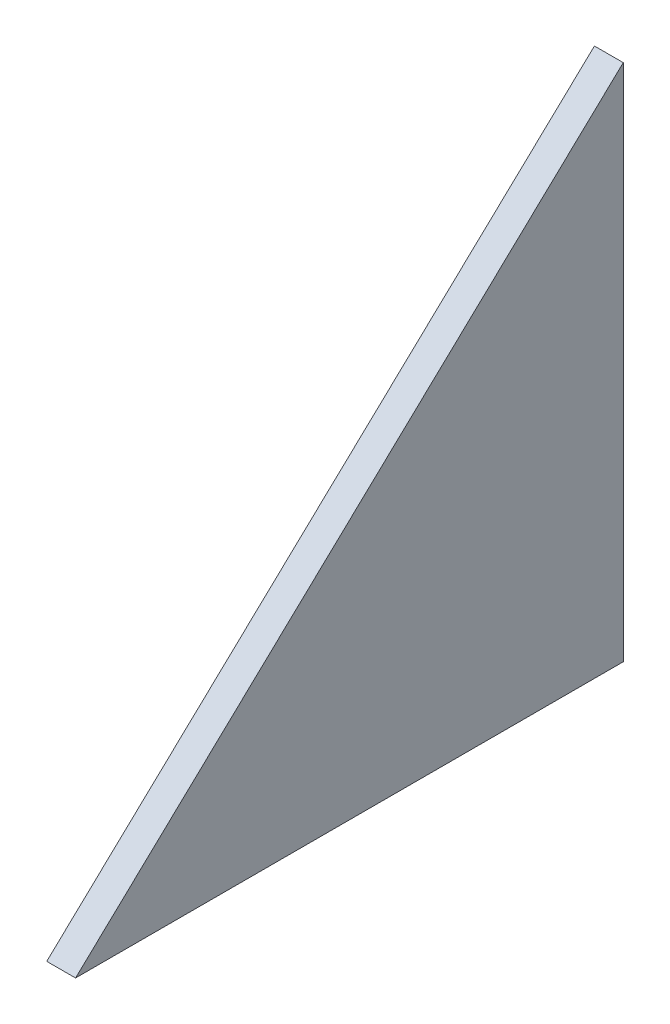
ISO-10303-21;
HEADER;
FILE_DESCRIPTION(('STEP AP214'),'2;1');
FILE_NAME('part.step','',(''),(''),'','','');
FILE_SCHEMA(('AUTOMOTIVE_DESIGN { 1 0 10303 214 1 1 1 1 }'));
ENDSEC;
DATA;
#1=APPLICATION_CONTEXT('core data for automotive mechanical design processes');
#2=APPLICATION_PROTOCOL_DEFINITION('international standard','automotive_design',2000,#1);
#3=PRODUCT_CONTEXT('',#1,'mechanical');
#4=PRODUCT('Part','Part','',(#3));
#5=PRODUCT_RELATED_PRODUCT_CATEGORY('part','',(#4));
#6=PRODUCT_DEFINITION_FORMATION('','',#4);
#7=PRODUCT_DEFINITION_CONTEXT('part definition',#1,'design');
#8=PRODUCT_DEFINITION('design','',#6,#7);
#9=PRODUCT_DEFINITION_SHAPE('','',#8);
#10=(LENGTH_UNIT() NAMED_UNIT(*) SI_UNIT(.MILLI.,.METRE.));
#11=(NAMED_UNIT(*) PLANE_ANGLE_UNIT() SI_UNIT($,.RADIAN.));
#12=(NAMED_UNIT(*) SI_UNIT($,.STERADIAN.) SOLID_ANGLE_UNIT());
#13=UNCERTAINTY_MEASURE_WITH_UNIT(LENGTH_MEASURE(1.E-05),#10,'distance_accuracy_value','');
#14=(GEOMETRIC_REPRESENTATION_CONTEXT(3) GLOBAL_UNCERTAINTY_ASSIGNED_CONTEXT((#13)) GLOBAL_UNIT_ASSIGNED_CONTEXT((#10,
#11,#12)) REPRESENTATION_CONTEXT('',''));
#15=CARTESIAN_POINT('',(0.,0.,0.));
#16=DIRECTION('',(0.,0.,1.));
#17=DIRECTION('',(1.,0.,0.));
#18=AXIS2_PLACEMENT_3D('',#15,#16,#17);
#19=CARTESIAN_POINT('',(5.,0.,0.));
#20=DIRECTION('',(0.,-0.725952683905827,-0.687744647910783));
#21=DIRECTION('',(0.,0.687744647910783,-0.725952683905827));
#22=AXIS2_PLACEMENT_3D('',#19,#20,#21);
#23=PLANE('',#22);
#24=DIRECTION('',(0.,-0.687744647910783,0.725952683905827));
#25=VECTOR('',#24,1.);
#26=CARTESIAN_POINT('',(0.,0.,0.));
#27=LINE('',#26,#25);
#28=CARTESIAN_POINT('',(0.,90.,-95.));
#29=VERTEX_POINT('',#28);
#30=CARTESIAN_POINT('',(0.,0.,0.));
#31=VERTEX_POINT('',#30);
#32=EDGE_CURVE('E86',#29,#31,#27,.T.);
#33=ORIENTED_EDGE('',*,*,#32,.T.);
#34=DIRECTION('',(-1.,0.,0.));
#35=VECTOR('',#34,1.);
#36=CARTESIAN_POINT('',(5.,0.,0.));
#37=LINE('',#36,#35);
#38=CARTESIAN_POINT('',(5.,0.,0.));
#39=VERTEX_POINT('',#38);
#40=EDGE_CURVE('E11',#39,#31,#37,.T.);
#41=ORIENTED_EDGE('',*,*,#40,.F.);
#42=DIRECTION('',(0.,-0.687744647910783,0.725952683905827));
#43=VECTOR('',#42,1.);
#44=CARTESIAN_POINT('',(5.,0.,0.));
#45=LINE('',#44,#43);
#46=CARTESIAN_POINT('',(5.,90.,-95.));
#47=VERTEX_POINT('',#46);
#48=EDGE_CURVE('E79',#47,#39,#45,.T.);
#49=ORIENTED_EDGE('',*,*,#48,.F.);
#50=DIRECTION('',(-1.,0.,0.));
#51=VECTOR('',#50,1.);
#52=CARTESIAN_POINT('',(5.,90.,-95.));
#53=LINE('',#52,#51);
#54=EDGE_CURVE('E87',#47,#29,#53,.T.);
#55=ORIENTED_EDGE('',*,*,#54,.T.);
#56=EDGE_LOOP('',(#33,#41,#49,#55));
#57=FACE_BOUND('',#56,.T.);
#58=ADVANCED_FACE('F39',(#57),#23,.F.);
#59=CARTESIAN_POINT('',(5.,0.,0.));
#60=DIRECTION('',(0.,1.,0.));
#61=DIRECTION('',(0.,0.,1.));
#62=AXIS2_PLACEMENT_3D('',#59,#60,#61);
#63=PLANE('',#62);
#64=DIRECTION('',(0.,0.,-1.));
#65=VECTOR('',#64,1.);
#66=CARTESIAN_POINT('',(0.,0.,0.));
#67=LINE('',#66,#65);
#68=CARTESIAN_POINT('',(0.,0.,-95.));
#69=VERTEX_POINT('',#68);
#70=EDGE_CURVE('E67',#31,#69,#67,.T.);
#71=ORIENTED_EDGE('',*,*,#70,.T.);
#72=DIRECTION('',(-1.,0.,0.));
#73=VECTOR('',#72,1.);
#74=CARTESIAN_POINT('',(5.,0.,-95.));
#75=LINE('',#74,#73);
#76=CARTESIAN_POINT('',(5.,0.,-95.));
#77=VERTEX_POINT('',#76);
#78=EDGE_CURVE('E47',#77,#69,#75,.T.);
#79=ORIENTED_EDGE('',*,*,#78,.F.);
#80=DIRECTION('',(0.,0.,-1.));
#81=VECTOR('',#80,1.);
#82=CARTESIAN_POINT('',(5.,0.,0.));
#83=LINE('',#82,#81);
#84=EDGE_CURVE('E75',#39,#77,#83,.T.);
#85=ORIENTED_EDGE('',*,*,#84,.F.);
#86=ORIENTED_EDGE('',*,*,#40,.T.);
#87=EDGE_LOOP('',(#71,#79,#85,#86));
#88=FACE_BOUND('',#87,.T.);
#89=ADVANCED_FACE('F76',(#88),#63,.F.);
#90=CARTESIAN_POINT('',(5.,90.,-95.));
#91=DIRECTION('',(0.,0.,1.));
#92=DIRECTION('',(0.,-1.,0.));
#93=AXIS2_PLACEMENT_3D('',#90,#91,#92);
#94=PLANE('',#93);
#95=DIRECTION('',(0.,1.,0.));
#96=VECTOR('',#95,1.);
#97=CARTESIAN_POINT('',(0.,90.,-95.));
#98=LINE('',#97,#96);
#99=EDGE_CURVE('E72',#69,#29,#98,.T.);
#100=ORIENTED_EDGE('',*,*,#99,.T.);
#101=ORIENTED_EDGE('',*,*,#54,.F.);
#102=DIRECTION('',(0.,1.,0.));
#103=VECTOR('',#102,1.);
#104=CARTESIAN_POINT('',(5.,90.,-95.));
#105=LINE('',#104,#103);
#106=EDGE_CURVE('E55',#77,#47,#105,.T.);
#107=ORIENTED_EDGE('',*,*,#106,.F.);
#108=ORIENTED_EDGE('',*,*,#78,.T.);
#109=EDGE_LOOP('',(#100,#101,#107,#108));
#110=FACE_BOUND('',#109,.T.);
#111=ADVANCED_FACE('F94',(#110),#94,.F.);
#112=CARTESIAN_POINT('',(5.,0.,0.));
#113=DIRECTION('',(-1.,0.,0.));
#114=DIRECTION('',(0.,0.,1.));
#115=AXIS2_PLACEMENT_3D('',#112,#113,#114);
#116=PLANE('',#115);
#117=ORIENTED_EDGE('',*,*,#48,.T.);
#118=ORIENTED_EDGE('',*,*,#84,.T.);
#119=ORIENTED_EDGE('',*,*,#106,.T.);
#120=EDGE_LOOP('',(#117,#118,#119));
#121=FACE_BOUND('',#120,.T.);
#122=ADVANCED_FACE('F82',(#121),#116,.F.);
#123=CARTESIAN_POINT('',(0.,0.,0.));
#124=DIRECTION('',(-1.,0.,0.));
#125=DIRECTION('',(0.,0.,1.));
#126=AXIS2_PLACEMENT_3D('',#123,#124,#125);
#127=PLANE('',#126);
#128=ORIENTED_EDGE('',*,*,#32,.F.);
#129=ORIENTED_EDGE('',*,*,#99,.F.);
#130=ORIENTED_EDGE('',*,*,#70,.F.);
#131=EDGE_LOOP('',(#128,#129,#130));
#132=FACE_BOUND('',#131,.T.);
#133=ADVANCED_FACE('F95',(#132),#127,.T.);
#134=CLOSED_SHELL('',(#58,#89,#111,#122,#133));
#135=MANIFOLD_SOLID_BREP('B2',#134);
#136=ADVANCED_BREP_SHAPE_REPRESENTATION('',(#18,#135),#14);
#137=SHAPE_DEFINITION_REPRESENTATION(#9,#136);
ENDSEC;
END-ISO-10303-21;
